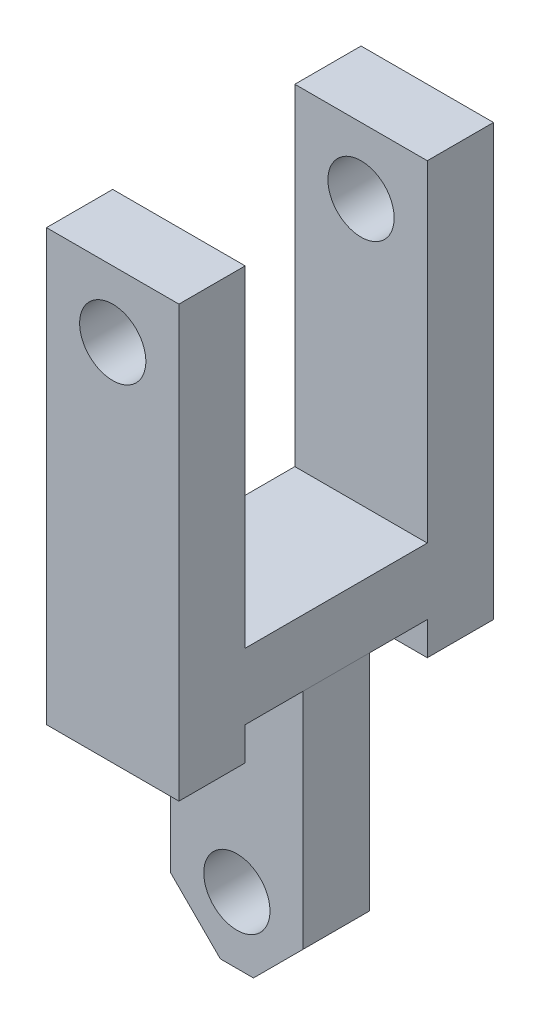
ISO-10303-21;
HEADER;
FILE_DESCRIPTION(('STEP AP214'),'2;1');
FILE_NAME('part.step','',(''),(''),'','','');
FILE_SCHEMA(('AUTOMOTIVE_DESIGN { 1 0 10303 214 1 1 1 1 }'));
ENDSEC;
DATA;
#1=APPLICATION_CONTEXT('core data for automotive mechanical design processes');
#2=APPLICATION_PROTOCOL_DEFINITION('international standard','automotive_design',2000,#1);
#3=PRODUCT_CONTEXT('',#1,'mechanical');
#4=PRODUCT('Part','Part','',(#3));
#5=PRODUCT_RELATED_PRODUCT_CATEGORY('part','',(#4));
#6=PRODUCT_DEFINITION_FORMATION('','',#4);
#7=PRODUCT_DEFINITION_CONTEXT('part definition',#1,'design');
#8=PRODUCT_DEFINITION('design','',#6,#7);
#9=PRODUCT_DEFINITION_SHAPE('','',#8);
#10=(LENGTH_UNIT() NAMED_UNIT(*) SI_UNIT(.MILLI.,.METRE.));
#11=(NAMED_UNIT(*) PLANE_ANGLE_UNIT() SI_UNIT($,.RADIAN.));
#12=(NAMED_UNIT(*) SI_UNIT($,.STERADIAN.) SOLID_ANGLE_UNIT());
#13=UNCERTAINTY_MEASURE_WITH_UNIT(LENGTH_MEASURE(1.E-05),#10,'distance_accuracy_value','');
#14=(GEOMETRIC_REPRESENTATION_CONTEXT(3) GLOBAL_UNCERTAINTY_ASSIGNED_CONTEXT((#13)) GLOBAL_UNIT_ASSIGNED_CONTEXT((#10,
#11,#12)) REPRESENTATION_CONTEXT('',''));
#15=CARTESIAN_POINT('',(0.,0.,0.));
#16=DIRECTION('',(0.,0.,1.));
#17=DIRECTION('',(1.,0.,0.));
#18=AXIS2_PLACEMENT_3D('',#15,#16,#17);
#19=CARTESIAN_POINT('',(25.401,128.5875,34.925));
#20=DIRECTION('',(0.,0.,-1.));
#21=DIRECTION('',(0.,1.,0.));
#22=AXIS2_PLACEMENT_3D('',#19,#20,#21);
#23=PLANE('',#22);
#24=DIRECTION('',(0.,1.,0.));
#25=VECTOR('',#24,1.);
#26=CARTESIAN_POINT('',(-25.4,128.5875,34.925));
#27=LINE('',#26,#25);
#28=CARTESIAN_POINT('',(-25.4,-36.5125,34.925));
#29=VERTEX_POINT('',#28);
#30=CARTESIAN_POINT('',(-25.4,-23.8125,34.925));
#31=VERTEX_POINT('',#30);
#32=EDGE_CURVE('E200',#29,#31,#27,.T.);
#33=ORIENTED_EDGE('',*,*,#32,.T.);
#34=DIRECTION('',(1.,0.,0.));
#35=VECTOR('',#34,1.);
#36=CARTESIAN_POINT('',(25.401,-23.8125,34.925));
#37=LINE('',#36,#35);
#38=CARTESIAN_POINT('',(25.4,-23.8125,34.925));
#39=VERTEX_POINT('',#38);
#40=EDGE_CURVE('E215',#31,#39,#37,.T.);
#41=ORIENTED_EDGE('',*,*,#40,.T.);
#42=DIRECTION('',(0.,1.,0.));
#43=VECTOR('',#42,1.);
#44=CARTESIAN_POINT('',(25.4,128.5875,34.925));
#45=LINE('',#44,#43);
#46=CARTESIAN_POINT('',(25.4,-36.5125,34.925));
#47=VERTEX_POINT('',#46);
#48=EDGE_CURVE('E205',#47,#39,#45,.T.);
#49=ORIENTED_EDGE('',*,*,#48,.F.);
#50=DIRECTION('',(-1.,0.,0.));
#51=VECTOR('',#50,1.);
#52=CARTESIAN_POINT('',(25.401,-36.5125,34.925));
#53=LINE('',#52,#51);
#54=EDGE_CURVE('E193',#47,#29,#53,.T.);
#55=ORIENTED_EDGE('',*,*,#54,.T.);
#56=EDGE_LOOP('',(#33,#41,#49,#55));
#57=FACE_BOUND('',#56,.T.);
#58=ADVANCED_FACE('F43',(#57),#23,.T.);
#59=CARTESIAN_POINT('',(-25.4,-128.5875,60.325));
#60=DIRECTION('',(0.,0.,1.));
#61=DIRECTION('',(1.,0.,0.));
#62=AXIS2_PLACEMENT_3D('',#59,#60,#61);
#63=PLANE('',#62);
#64=DIRECTION('',(0.,-1.,0.));
#65=VECTOR('',#64,1.);
#66=CARTESIAN_POINT('',(-25.4,128.5875,60.325));
#67=LINE('',#66,#65);
#68=CARTESIAN_POINT('',(-25.4,128.5875,60.325));
#69=VERTEX_POINT('',#68);
#70=CARTESIAN_POINT('',(-25.4,-36.5125,60.325));
#71=VERTEX_POINT('',#70);
#72=EDGE_CURVE('E180',#69,#71,#67,.T.);
#73=ORIENTED_EDGE('',*,*,#72,.T.);
#74=DIRECTION('',(-1.,0.,0.));
#75=VECTOR('',#74,1.);
#76=CARTESIAN_POINT('',(25.401,-36.5125,60.325));
#77=LINE('',#76,#75);
#78=CARTESIAN_POINT('',(25.4,-36.5125,60.325));
#79=VERTEX_POINT('',#78);
#80=EDGE_CURVE('E196',#79,#71,#77,.T.);
#81=ORIENTED_EDGE('',*,*,#80,.F.);
#82=DIRECTION('',(0.,1.,0.));
#83=VECTOR('',#82,1.);
#84=CARTESIAN_POINT('',(25.4,128.5875,60.325));
#85=LINE('',#84,#83);
#86=CARTESIAN_POINT('',(25.4,128.5875,60.325));
#87=VERTEX_POINT('',#86);
#88=EDGE_CURVE('E185',#79,#87,#85,.T.);
#89=ORIENTED_EDGE('',*,*,#88,.T.);
#90=DIRECTION('',(-1.,0.,0.));
#91=VECTOR('',#90,1.);
#92=CARTESIAN_POINT('',(-25.4,128.5875,60.325));
#93=LINE('',#92,#91);
#94=EDGE_CURVE('E182',#87,#69,#93,.T.);
#95=ORIENTED_EDGE('',*,*,#94,.T.);
#96=EDGE_LOOP('',(#73,#81,#89,#95));
#97=FACE_BOUND('',#96,.T.);
#98=CARTESIAN_POINT('',(0.,103.1875,60.325));
#99=DIRECTION('',(0.,0.,1.));
#100=DIRECTION('',(1.,0.,0.));
#101=AXIS2_PLACEMENT_3D('',#98,#99,#100);
#102=CIRCLE('',#101,12.7);
#103=CARTESIAN_POINT('',(-12.7,103.1875,60.325));
#104=VERTEX_POINT('',#103);
#105=EDGE_CURVE('E188',#104,#104,#102,.T.);
#106=ORIENTED_EDGE('',*,*,#105,.F.);
#107=EDGE_LOOP('',(#106));
#108=FACE_BOUND('',#107,.T.);
#109=ADVANCED_FACE('F267',(#97,#108),#63,.T.);
#110=CARTESIAN_POINT('',(-25.4,128.5875,60.325));
#111=DIRECTION('',(1.,0.,0.));
#112=DIRECTION('',(0.,1.,0.));
#113=AXIS2_PLACEMENT_3D('',#110,#111,#112);
#114=PLANE('',#113);
#115=DIRECTION('',(0.,0.,-1.));
#116=VECTOR('',#115,1.);
#117=CARTESIAN_POINT('',(-25.4,1.58749999999998,60.325));
#118=LINE('',#117,#116);
#119=CARTESIAN_POINT('',(-25.4,1.58749999999998,34.925));
#120=VERTEX_POINT('',#119);
#121=CARTESIAN_POINT('',(-25.4,1.58749999999998,-34.925));
#122=VERTEX_POINT('',#121);
#123=EDGE_CURVE('E143',#120,#122,#118,.T.);
#124=ORIENTED_EDGE('',*,*,#123,.T.);
#125=DIRECTION('',(0.,-1.,0.));
#126=VECTOR('',#125,1.);
#127=CARTESIAN_POINT('',(-25.4,128.5875,-34.925));
#128=LINE('',#127,#126);
#129=CARTESIAN_POINT('',(-25.4,128.5875,-34.925));
#130=VERTEX_POINT('',#129);
#131=EDGE_CURVE('E252',#130,#122,#128,.T.);
#132=ORIENTED_EDGE('',*,*,#131,.F.);
#133=DIRECTION('',(0.,0.,-1.));
#134=VECTOR('',#133,1.);
#135=CARTESIAN_POINT('',(-25.4,128.5875,60.325));
#136=LINE('',#135,#134);
#137=CARTESIAN_POINT('',(-25.4,128.5875,-60.325));
#138=VERTEX_POINT('',#137);
#139=EDGE_CURVE('E137',#130,#138,#136,.T.);
#140=ORIENTED_EDGE('',*,*,#139,.T.);
#141=DIRECTION('',(0.,-1.,0.));
#142=VECTOR('',#141,1.);
#143=CARTESIAN_POINT('',(-25.4,1.58749999999998,-60.325));
#144=LINE('',#143,#142);
#145=CARTESIAN_POINT('',(-25.4,-36.5125,-60.325));
#146=VERTEX_POINT('',#145);
#147=EDGE_CURVE('E131',#138,#146,#144,.T.);
#148=ORIENTED_EDGE('',*,*,#147,.T.);
#149=DIRECTION('',(0.,0.,-1.));
#150=VECTOR('',#149,1.);
#151=CARTESIAN_POINT('',(-25.4,-36.5125,-34.925));
#152=LINE('',#151,#150);
#153=CARTESIAN_POINT('',(-25.4,-36.5125,-34.925));
#154=VERTEX_POINT('',#153);
#155=EDGE_CURVE('E134',#154,#146,#152,.T.);
#156=ORIENTED_EDGE('',*,*,#155,.F.);
#157=CARTESIAN_POINT('',(-25.4,-23.8125,-34.925));
#158=VERTEX_POINT('',#157);
#159=EDGE_CURVE('E153',#158,#154,#128,.T.);
#160=ORIENTED_EDGE('',*,*,#159,.F.);
#161=DIRECTION('',(0.,0.,-1.));
#162=VECTOR('',#161,1.);
#163=CARTESIAN_POINT('',(-25.4,-23.8125,60.325));
#164=LINE('',#163,#162);
#165=EDGE_CURVE('E174',#31,#158,#164,.T.);
#166=ORIENTED_EDGE('',*,*,#165,.F.);
#167=ORIENTED_EDGE('',*,*,#32,.F.);
#168=DIRECTION('',(0.,0.,-1.));
#169=VECTOR('',#168,1.);
#170=CARTESIAN_POINT('',(-25.4,-36.5125,34.925));
#171=LINE('',#170,#169);
#172=EDGE_CURVE('E199',#71,#29,#171,.T.);
#173=ORIENTED_EDGE('',*,*,#172,.F.);
#174=ORIENTED_EDGE('',*,*,#72,.F.);
#175=DIRECTION('',(0.,0.,-1.));
#176=VECTOR('',#175,1.);
#177=CARTESIAN_POINT('',(-25.4,128.5875,60.325));
#178=LINE('',#177,#176);
#179=CARTESIAN_POINT('',(-25.4,128.5875,34.925));
#180=VERTEX_POINT('',#179);
#181=EDGE_CURVE('E184',#69,#180,#178,.T.);
#182=ORIENTED_EDGE('',*,*,#181,.T.);
#183=EDGE_CURVE('E195',#120,#180,#27,.T.);
#184=ORIENTED_EDGE('',*,*,#183,.F.);
#185=EDGE_LOOP('',(#124,#132,#140,#148,#156,#160,#166,#167,#173,#174,#182,#184));
#186=FACE_BOUND('',#185,.T.);
#187=ADVANCED_FACE('F45',(#186),#114,.F.);
#188=CARTESIAN_POINT('',(25.4,128.5875,60.325));
#189=DIRECTION('',(-1.,0.,0.));
#190=DIRECTION('',(0.,-1.,0.));
#191=AXIS2_PLACEMENT_3D('',#188,#189,#190);
#192=PLANE('',#191);
#193=DIRECTION('',(0.,0.,1.));
#194=VECTOR('',#193,1.);
#195=CARTESIAN_POINT('',(25.4,-23.8125,60.325));
#196=LINE('',#195,#194);
#197=CARTESIAN_POINT('',(25.4,-23.8125,-34.925));
#198=VERTEX_POINT('',#197);
#199=EDGE_CURVE('E172',#198,#39,#196,.T.);
#200=ORIENTED_EDGE('',*,*,#199,.F.);
#201=DIRECTION('',(0.,-1.,0.));
#202=VECTOR('',#201,1.);
#203=CARTESIAN_POINT('',(25.4,128.5875,-34.925));
#204=LINE('',#203,#202);
#205=CARTESIAN_POINT('',(25.4,-36.5125,-34.925));
#206=VERTEX_POINT('',#205);
#207=EDGE_CURVE('E66',#198,#206,#204,.T.);
#208=ORIENTED_EDGE('',*,*,#207,.T.);
#209=DIRECTION('',(0.,0.,-1.));
#210=VECTOR('',#209,1.);
#211=CARTESIAN_POINT('',(25.4,-36.5125,-34.925));
#212=LINE('',#211,#210);
#213=CARTESIAN_POINT('',(25.4,-36.5125,-60.325));
#214=VERTEX_POINT('',#213);
#215=EDGE_CURVE('E243',#206,#214,#212,.T.);
#216=ORIENTED_EDGE('',*,*,#215,.T.);
#217=DIRECTION('',(0.,-1.,0.));
#218=VECTOR('',#217,1.);
#219=CARTESIAN_POINT('',(25.4,1.58749999999998,-60.325));
#220=LINE('',#219,#218);
#221=CARTESIAN_POINT('',(25.4,128.5875,-60.325));
#222=VERTEX_POINT('',#221);
#223=EDGE_CURVE('E142',#222,#214,#220,.T.);
#224=ORIENTED_EDGE('',*,*,#223,.F.);
#225=DIRECTION('',(0.,0.,-1.));
#226=VECTOR('',#225,1.);
#227=CARTESIAN_POINT('',(25.4,128.5875,60.325));
#228=LINE('',#227,#226);
#229=CARTESIAN_POINT('',(25.4,128.5875,-34.925));
#230=VERTEX_POINT('',#229);
#231=EDGE_CURVE('E168',#230,#222,#228,.T.);
#232=ORIENTED_EDGE('',*,*,#231,.F.);
#233=CARTESIAN_POINT('',(25.4,1.58749999999999,-34.925));
#234=VERTEX_POINT('',#233);
#235=EDGE_CURVE('E240',#230,#234,#204,.T.);
#236=ORIENTED_EDGE('',*,*,#235,.T.);
#237=DIRECTION('',(0.,0.,1.));
#238=VECTOR('',#237,1.);
#239=CARTESIAN_POINT('',(25.4,1.58749999999998,60.325));
#240=LINE('',#239,#238);
#241=CARTESIAN_POINT('',(25.4,1.58749999999998,34.925));
#242=VERTEX_POINT('',#241);
#243=EDGE_CURVE('E177',#234,#242,#240,.T.);
#244=ORIENTED_EDGE('',*,*,#243,.T.);
#245=CARTESIAN_POINT('',(25.4,128.5875,34.925));
#246=VERTEX_POINT('',#245);
#247=EDGE_CURVE('E208',#242,#246,#45,.T.);
#248=ORIENTED_EDGE('',*,*,#247,.T.);
#249=DIRECTION('',(0.,0.,-1.));
#250=VECTOR('',#249,1.);
#251=CARTESIAN_POINT('',(25.4,128.5875,60.325));
#252=LINE('',#251,#250);
#253=EDGE_CURVE('E192',#87,#246,#252,.T.);
#254=ORIENTED_EDGE('',*,*,#253,.F.);
#255=ORIENTED_EDGE('',*,*,#88,.F.);
#256=DIRECTION('',(0.,0.,-1.));
#257=VECTOR('',#256,1.);
#258=CARTESIAN_POINT('',(25.4,-36.5125,34.925));
#259=LINE('',#258,#257);
#260=EDGE_CURVE('E204',#79,#47,#259,.T.);
#261=ORIENTED_EDGE('',*,*,#260,.T.);
#262=ORIENTED_EDGE('',*,*,#48,.T.);
#263=EDGE_LOOP('',(#200,#208,#216,#224,#232,#236,#244,#248,#254,#255,#261,#262));
#264=FACE_BOUND('',#263,.T.);
#265=ADVANCED_FACE('F235',(#264),#192,.F.);
#266=CARTESIAN_POINT('',(-25.4,128.5875,60.325));
#267=DIRECTION('',(0.,-1.,0.));
#268=DIRECTION('',(0.,0.,-1.));
#269=AXIS2_PLACEMENT_3D('',#266,#267,#268);
#270=PLANE('',#269);
#271=DIRECTION('',(-1.,0.,0.));
#272=VECTOR('',#271,1.);
#273=CARTESIAN_POINT('',(25.401,128.5875,34.925));
#274=LINE('',#273,#272);
#275=EDGE_CURVE('E201',#246,#180,#274,.T.);
#276=ORIENTED_EDGE('',*,*,#275,.T.);
#277=ORIENTED_EDGE('',*,*,#181,.F.);
#278=ORIENTED_EDGE('',*,*,#94,.F.);
#279=ORIENTED_EDGE('',*,*,#253,.T.);
#280=EDGE_LOOP('',(#276,#277,#278,#279));
#281=FACE_BOUND('',#280,.T.);
#282=ADVANCED_FACE('F282',(#281),#270,.F.);
#283=CARTESIAN_POINT('',(0.,103.1875,60.325));
#284=DIRECTION('',(0.,0.,-1.));
#285=DIRECTION('',(-1.,0.,0.));
#286=AXIS2_PLACEMENT_3D('',#283,#284,#285);
#287=CYLINDRICAL_SURFACE('',#286,12.7);
#288=CARTESIAN_POINT('',(0.,103.1875,34.925));
#289=DIRECTION('',(0.,0.,-1.));
#290=DIRECTION('',(0.,1.,0.));
#291=AXIS2_PLACEMENT_3D('',#288,#289,#290);
#292=CIRCLE('',#291,12.7);
#293=CARTESIAN_POINT('',(-12.7,103.1875,34.925));
#294=VERTEX_POINT('',#293);
#295=EDGE_CURVE('E191',#294,#294,#292,.F.);
#296=CARTESIAN_POINT('',(-12.7,103.1875,60.325));
#297=CARTESIAN_POINT('',(-12.7,103.1875,60.0604166666667));
#298=CARTESIAN_POINT('',(-12.7,103.1875,59.7958333333333));
#299=CARTESIAN_POINT('',(-12.7,103.1875,59.2666666666667));
#300=CARTESIAN_POINT('',(-12.7,103.1875,59.0020833333333));
#301=CARTESIAN_POINT('',(-12.7,103.1875,58.4729166666667));
#302=CARTESIAN_POINT('',(-12.7,103.1875,58.2083333333333));
#303=CARTESIAN_POINT('',(-12.7,103.1875,57.6791666666667));
#304=CARTESIAN_POINT('',(-12.7,103.1875,57.4145833333333));
#305=CARTESIAN_POINT('',(-12.7,103.1875,56.8854166666667));
#306=CARTESIAN_POINT('',(-12.7,103.1875,56.6208333333333));
#307=CARTESIAN_POINT('',(-12.7,103.1875,56.0916666666667));
#308=CARTESIAN_POINT('',(-12.7,103.1875,55.8270833333333));
#309=CARTESIAN_POINT('',(-12.7,103.1875,55.2979166666667));
#310=CARTESIAN_POINT('',(-12.7,103.1875,55.0333333333333));
#311=CARTESIAN_POINT('',(-12.7,103.1875,54.5041666666667));
#312=CARTESIAN_POINT('',(-12.7,103.1875,54.2395833333333));
#313=CARTESIAN_POINT('',(-12.7,103.1875,53.7104166666667));
#314=CARTESIAN_POINT('',(-12.7,103.1875,53.4458333333333));
#315=CARTESIAN_POINT('',(-12.7,103.1875,52.9166666666667));
#316=CARTESIAN_POINT('',(-12.7,103.1875,52.6520833333333));
#317=CARTESIAN_POINT('',(-12.7,103.1875,52.1229166666667));
#318=CARTESIAN_POINT('',(-12.7,103.1875,51.8583333333333));
#319=CARTESIAN_POINT('',(-12.7,103.1875,51.3291666666667));
#320=CARTESIAN_POINT('',(-12.7,103.1875,51.0645833333333));
#321=CARTESIAN_POINT('',(-12.7,103.1875,50.5354166666667));
#322=CARTESIAN_POINT('',(-12.7,103.1875,50.2708333333333));
#323=CARTESIAN_POINT('',(-12.7,103.1875,49.7416666666667));
#324=CARTESIAN_POINT('',(-12.7,103.1875,49.4770833333333));
#325=CARTESIAN_POINT('',(-12.7,103.1875,48.9479166666667));
#326=CARTESIAN_POINT('',(-12.7,103.1875,48.6833333333333));
#327=CARTESIAN_POINT('',(-12.7,103.1875,48.1541666666667));
#328=CARTESIAN_POINT('',(-12.7,103.1875,47.8895833333333));
#329=CARTESIAN_POINT('',(-12.7,103.1875,47.3604166666667));
#330=CARTESIAN_POINT('',(-12.7,103.1875,47.0958333333333));
#331=CARTESIAN_POINT('',(-12.7,103.1875,46.5666666666667));
#332=CARTESIAN_POINT('',(-12.7,103.1875,46.3020833333333));
#333=CARTESIAN_POINT('',(-12.7,103.1875,45.7729166666667));
#334=CARTESIAN_POINT('',(-12.7,103.1875,45.5083333333333));
#335=CARTESIAN_POINT('',(-12.7,103.1875,44.9791666666667));
#336=CARTESIAN_POINT('',(-12.7,103.1875,44.7145833333333));
#337=CARTESIAN_POINT('',(-12.7,103.1875,44.1854166666667));
#338=CARTESIAN_POINT('',(-12.7,103.1875,43.9208333333333));
#339=CARTESIAN_POINT('',(-12.7,103.1875,43.3916666666667));
#340=CARTESIAN_POINT('',(-12.7,103.1875,43.1270833333333));
#341=CARTESIAN_POINT('',(-12.7,103.1875,42.5979166666667));
#342=CARTESIAN_POINT('',(-12.7,103.1875,42.3333333333333));
#343=CARTESIAN_POINT('',(-12.7,103.1875,41.8041666666667));
#344=CARTESIAN_POINT('',(-12.7,103.1875,41.5395833333333));
#345=CARTESIAN_POINT('',(-12.7,103.1875,41.0104166666667));
#346=CARTESIAN_POINT('',(-12.7,103.1875,40.7458333333333));
#347=CARTESIAN_POINT('',(-12.7,103.1875,40.2166666666667));
#348=CARTESIAN_POINT('',(-12.7,103.1875,39.9520833333333));
#349=CARTESIAN_POINT('',(-12.7,103.1875,39.4229166666667));
#350=CARTESIAN_POINT('',(-12.7,103.1875,39.1583333333333));
#351=CARTESIAN_POINT('',(-12.7,103.1875,38.6291666666667));
#352=CARTESIAN_POINT('',(-12.7,103.1875,38.3645833333333));
#353=CARTESIAN_POINT('',(-12.7,103.1875,37.8354166666667));
#354=CARTESIAN_POINT('',(-12.7,103.1875,37.5708333333333));
#355=CARTESIAN_POINT('',(-12.7,103.1875,37.0416666666667));
#356=CARTESIAN_POINT('',(-12.7,103.1875,36.7770833333333));
#357=CARTESIAN_POINT('',(-12.7,103.1875,36.2479166666667));
#358=CARTESIAN_POINT('',(-12.7,103.1875,35.9833333333333));
#359=CARTESIAN_POINT('',(-12.7,103.1875,35.4541666666667));
#360=CARTESIAN_POINT('',(-12.7,103.1875,35.1895833333333));
#361=CARTESIAN_POINT('',(-12.7,103.1875,34.925));
#362=B_SPLINE_CURVE_WITH_KNOTS('',3,(#296,#297,#298,#299,#300,#301,#302,#303,#304,#305,#306,
#307,#308,#309,#310,#311,#312,#313,#314,#315,#316,#317,#318,#319,#320,#321,#322,#323,#324,#325,
#326,#327,#328,#329,#330,#331,#332,#333,#334,#335,#336,#337,#338,#339,#340,#341,#342,#343,#344,
#345,#346,#347,#348,#349,#350,#351,#352,#353,#354,#355,#356,#357,#358,#359,#360,#361),
.UNSPECIFIED.,.F.,.F.,(4,2,2,2,2,2,2,2,2,2,2,2,2,2,2,2,2,2,2,2,2,2,2,2,2,2,2,2,2,2,2,2,4),(0.,
0.793750000000003,1.58750000000001,2.38125,3.175,3.96875,4.7625,5.55625,6.35,7.14375,7.9375,
8.73125,9.525,10.31875,11.1125,11.90625,12.7,13.49375,14.2875,15.08125,15.875,16.66875,17.4625,
18.25625,19.05,19.84375,20.6375,21.43125,22.225,23.01875,23.8125,24.60625,25.4),.UNSPECIFIED.);
#363=EDGE_CURVE('BSEAM277',#104,#294,#362,.T.);
#364=ORIENTED_EDGE('',*,*,#105,.T.);
#365=ORIENTED_EDGE('',*,*,#295,.F.);
#366=ORIENTED_EDGE('',*,*,#363,.T.);
#367=ORIENTED_EDGE('',*,*,#363,.F.);
#368=EDGE_LOOP('',(#364,#366,#365,#367));
#369=FACE_BOUND('',#368,.T.);
#370=ADVANCED_FACE('F277',(#369),#287,.F.);
#371=DIRECTION('',(1.,0.,0.));
#372=VECTOR('',#371,1.);
#373=CARTESIAN_POINT('',(25.401,1.58749999999999,34.925));
#374=LINE('',#373,#372);
#375=EDGE_CURVE('E51',#120,#242,#374,.T.);
#376=ORIENTED_EDGE('',*,*,#375,.F.);
#377=ORIENTED_EDGE('',*,*,#183,.T.);
#378=ORIENTED_EDGE('',*,*,#275,.F.);
#379=ORIENTED_EDGE('',*,*,#247,.F.);
#380=EDGE_LOOP('',(#376,#377,#378,#379));
#381=FACE_BOUND('',#380,.T.);
#382=ORIENTED_EDGE('',*,*,#295,.T.);
#383=EDGE_LOOP('',(#382));
#384=FACE_BOUND('',#383,.T.);
#385=ADVANCED_FACE('F230',(#381,#384),#23,.T.);
#386=CARTESIAN_POINT('',(25.401,-36.5125,34.925));
#387=DIRECTION('',(0.,-1.,0.));
#388=DIRECTION('',(0.,0.,-1.));
#389=AXIS2_PLACEMENT_3D('',#386,#387,#388);
#390=PLANE('',#389);
#391=ORIENTED_EDGE('',*,*,#80,.T.);
#392=ORIENTED_EDGE('',*,*,#172,.T.);
#393=ORIENTED_EDGE('',*,*,#54,.F.);
#394=ORIENTED_EDGE('',*,*,#260,.F.);
#395=EDGE_LOOP('',(#391,#392,#393,#394));
#396=FACE_BOUND('',#395,.T.);
#397=ADVANCED_FACE('F276',(#396),#390,.T.);
#398=CARTESIAN_POINT('',(25.4,1.58749999999998,-60.325));
#399=DIRECTION('',(0.,0.,-1.));
#400=DIRECTION('',(-1.,0.,0.));
#401=AXIS2_PLACEMENT_3D('',#398,#399,#400);
#402=PLANE('',#401);
#403=ORIENTED_EDGE('',*,*,#223,.T.);
#404=DIRECTION('',(-1.,0.,0.));
#405=VECTOR('',#404,1.);
#406=CARTESIAN_POINT('',(25.401,-36.5125,-60.325));
#407=LINE('',#406,#405);
#408=EDGE_CURVE('E150',#214,#146,#407,.T.);
#409=ORIENTED_EDGE('',*,*,#408,.T.);
#410=ORIENTED_EDGE('',*,*,#147,.F.);
#411=DIRECTION('',(-1.,0.,0.));
#412=VECTOR('',#411,1.);
#413=CARTESIAN_POINT('',(-25.4,128.5875,-60.325));
#414=LINE('',#413,#412);
#415=EDGE_CURVE('E160',#222,#138,#414,.T.);
#416=ORIENTED_EDGE('',*,*,#415,.F.);
#417=EDGE_LOOP('',(#403,#409,#410,#416));
#418=FACE_BOUND('',#417,.T.);
#419=CARTESIAN_POINT('',(0.,103.1875,-60.325));
#420=DIRECTION('',(0.,0.,1.));
#421=DIRECTION('',(1.,0.,0.));
#422=AXIS2_PLACEMENT_3D('',#419,#420,#421);
#423=CIRCLE('',#422,12.7);
#424=CARTESIAN_POINT('',(-12.7,103.1875,-60.325));
#425=VERTEX_POINT('',#424);
#426=EDGE_CURVE('E157',#425,#425,#423,.T.);
#427=ORIENTED_EDGE('',*,*,#426,.T.);
#428=EDGE_LOOP('',(#427));
#429=FACE_BOUND('',#428,.T.);
#430=ADVANCED_FACE('F155',(#418,#429),#402,.T.);
#431=CARTESIAN_POINT('',(25.4,1.58749999999998,-60.325));
#432=DIRECTION('',(0.,1.,0.));
#433=DIRECTION('',(0.,0.,1.));
#434=AXIS2_PLACEMENT_3D('',#431,#432,#433);
#435=PLANE('',#434);
#436=DIRECTION('',(1.,0.,0.));
#437=VECTOR('',#436,1.);
#438=CARTESIAN_POINT('',(25.4,1.58749999999998,-34.925));
#439=LINE('',#438,#437);
#440=EDGE_CURVE('E58',#122,#234,#439,.T.);
#441=ORIENTED_EDGE('',*,*,#440,.F.);
#442=ORIENTED_EDGE('',*,*,#123,.F.);
#443=ORIENTED_EDGE('',*,*,#375,.T.);
#444=ORIENTED_EDGE('',*,*,#243,.F.);
#445=EDGE_LOOP('',(#441,#442,#443,#444));
#446=FACE_BOUND('',#445,.T.);
#447=ADVANCED_FACE('F226',(#446),#435,.T.);
#448=CARTESIAN_POINT('',(25.4,-23.8125,-60.325));
#449=DIRECTION('',(0.,1.,0.));
#450=DIRECTION('',(0.,0.,1.));
#451=AXIS2_PLACEMENT_3D('',#448,#449,#450);
#452=PLANE('',#451);
#453=ORIENTED_EDGE('',*,*,#165,.T.);
#454=DIRECTION('',(1.,0.,0.));
#455=VECTOR('',#454,1.);
#456=CARTESIAN_POINT('',(25.4,-23.8125,-34.925));
#457=LINE('',#456,#455);
#458=EDGE_CURVE('E12',#158,#198,#457,.T.);
#459=ORIENTED_EDGE('',*,*,#458,.T.);
#460=ORIENTED_EDGE('',*,*,#199,.T.);
#461=ORIENTED_EDGE('',*,*,#40,.F.);
#462=EDGE_LOOP('',(#453,#459,#460,#461));
#463=FACE_BOUND('',#462,.T.);
#464=ADVANCED_FACE('F348',(#463),#452,.F.);
#465=CARTESIAN_POINT('',(25.401,-36.5125,-34.925));
#466=DIRECTION('',(0.,-1.,0.));
#467=DIRECTION('',(0.,0.,-1.));
#468=AXIS2_PLACEMENT_3D('',#465,#466,#467);
#469=PLANE('',#468);
#470=DIRECTION('',(-1.,0.,0.));
#471=VECTOR('',#470,1.);
#472=CARTESIAN_POINT('',(25.401,-36.5125,-34.925));
#473=LINE('',#472,#471);
#474=EDGE_CURVE('E152',#206,#154,#473,.T.);
#475=ORIENTED_EDGE('',*,*,#474,.T.);
#476=ORIENTED_EDGE('',*,*,#155,.T.);
#477=ORIENTED_EDGE('',*,*,#408,.F.);
#478=ORIENTED_EDGE('',*,*,#215,.F.);
#479=EDGE_LOOP('',(#475,#476,#477,#478));
#480=FACE_BOUND('',#479,.T.);
#481=ADVANCED_FACE('F148',(#480),#469,.T.);
#482=CARTESIAN_POINT('',(25.401,128.5875,-34.925));
#483=DIRECTION('',(0.,0.,1.));
#484=DIRECTION('',(0.,-1.,0.));
#485=AXIS2_PLACEMENT_3D('',#482,#483,#484);
#486=PLANE('',#485);
#487=ORIENTED_EDGE('',*,*,#458,.F.);
#488=ORIENTED_EDGE('',*,*,#159,.T.);
#489=ORIENTED_EDGE('',*,*,#474,.F.);
#490=ORIENTED_EDGE('',*,*,#207,.F.);
#491=EDGE_LOOP('',(#487,#488,#489,#490));
#492=FACE_BOUND('',#491,.T.);
#493=ADVANCED_FACE('F257',(#492),#486,.T.);
#494=CARTESIAN_POINT('',(-25.4,128.5875,60.325));
#495=DIRECTION('',(0.,-1.,0.));
#496=DIRECTION('',(0.,0.,-1.));
#497=AXIS2_PLACEMENT_3D('',#494,#495,#496);
#498=PLANE('',#497);
#499=DIRECTION('',(-1.,0.,0.));
#500=VECTOR('',#499,1.);
#501=CARTESIAN_POINT('',(25.401,128.5875,-34.925));
#502=LINE('',#501,#500);
#503=EDGE_CURVE('E162',#230,#130,#502,.T.);
#504=ORIENTED_EDGE('',*,*,#503,.F.);
#505=ORIENTED_EDGE('',*,*,#231,.T.);
#506=ORIENTED_EDGE('',*,*,#415,.T.);
#507=ORIENTED_EDGE('',*,*,#139,.F.);
#508=EDGE_LOOP('',(#504,#505,#506,#507));
#509=FACE_BOUND('',#508,.T.);
#510=ADVANCED_FACE('F254',(#509),#498,.F.);
#511=CARTESIAN_POINT('',(0.,103.1875,60.325));
#512=DIRECTION('',(0.,0.,-1.));
#513=DIRECTION('',(-1.,0.,0.));
#514=AXIS2_PLACEMENT_3D('',#511,#512,#513);
#515=CYLINDRICAL_SURFACE('',#514,12.7);
#516=CARTESIAN_POINT('',(0.,103.1875,-34.925));
#517=DIRECTION('',(0.,0.,1.));
#518=DIRECTION('',(0.,-1.,0.));
#519=AXIS2_PLACEMENT_3D('',#516,#517,#518);
#520=CIRCLE('',#519,12.7);
#521=CARTESIAN_POINT('',(-12.7,103.1875,-34.925));
#522=VERTEX_POINT('',#521);
#523=EDGE_CURVE('E246',#522,#522,#520,.F.);
#524=CARTESIAN_POINT('',(-12.7,103.1875,-60.325));
#525=CARTESIAN_POINT('',(-12.7,103.1875,-60.0604166666667));
#526=CARTESIAN_POINT('',(-12.7,103.1875,-59.7958333333333));
#527=CARTESIAN_POINT('',(-12.7,103.1875,-59.2666666666667));
#528=CARTESIAN_POINT('',(-12.7,103.1875,-59.0020833333333));
#529=CARTESIAN_POINT('',(-12.7,103.1875,-58.4729166666667));
#530=CARTESIAN_POINT('',(-12.7,103.1875,-58.2083333333333));
#531=CARTESIAN_POINT('',(-12.7,103.1875,-57.6791666666667));
#532=CARTESIAN_POINT('',(-12.7,103.1875,-57.4145833333333));
#533=CARTESIAN_POINT('',(-12.7,103.1875,-56.8854166666667));
#534=CARTESIAN_POINT('',(-12.7,103.1875,-56.6208333333333));
#535=CARTESIAN_POINT('',(-12.7,103.1875,-56.0916666666667));
#536=CARTESIAN_POINT('',(-12.7,103.1875,-55.8270833333333));
#537=CARTESIAN_POINT('',(-12.7,103.1875,-55.2979166666667));
#538=CARTESIAN_POINT('',(-12.7,103.1875,-55.0333333333333));
#539=CARTESIAN_POINT('',(-12.7,103.1875,-54.5041666666667));
#540=CARTESIAN_POINT('',(-12.7,103.1875,-54.2395833333333));
#541=CARTESIAN_POINT('',(-12.7,103.1875,-53.7104166666667));
#542=CARTESIAN_POINT('',(-12.7,103.1875,-53.4458333333333));
#543=CARTESIAN_POINT('',(-12.7,103.1875,-52.9166666666667));
#544=CARTESIAN_POINT('',(-12.7,103.1875,-52.6520833333333));
#545=CARTESIAN_POINT('',(-12.7,103.1875,-52.1229166666667));
#546=CARTESIAN_POINT('',(-12.7,103.1875,-51.8583333333333));
#547=CARTESIAN_POINT('',(-12.7,103.1875,-51.3291666666667));
#548=CARTESIAN_POINT('',(-12.7,103.1875,-51.0645833333333));
#549=CARTESIAN_POINT('',(-12.7,103.1875,-50.5354166666667));
#550=CARTESIAN_POINT('',(-12.7,103.1875,-50.2708333333333));
#551=CARTESIAN_POINT('',(-12.7,103.1875,-49.7416666666667));
#552=CARTESIAN_POINT('',(-12.7,103.1875,-49.4770833333333));
#553=CARTESIAN_POINT('',(-12.7,103.1875,-48.9479166666667));
#554=CARTESIAN_POINT('',(-12.7,103.1875,-48.6833333333333));
#555=CARTESIAN_POINT('',(-12.7,103.1875,-48.1541666666667));
#556=CARTESIAN_POINT('',(-12.7,103.1875,-47.8895833333333));
#557=CARTESIAN_POINT('',(-12.7,103.1875,-47.3604166666667));
#558=CARTESIAN_POINT('',(-12.7,103.1875,-47.0958333333333));
#559=CARTESIAN_POINT('',(-12.7,103.1875,-46.5666666666667));
#560=CARTESIAN_POINT('',(-12.7,103.1875,-46.3020833333333));
#561=CARTESIAN_POINT('',(-12.7,103.1875,-45.7729166666667));
#562=CARTESIAN_POINT('',(-12.7,103.1875,-45.5083333333333));
#563=CARTESIAN_POINT('',(-12.7,103.1875,-44.9791666666667));
#564=CARTESIAN_POINT('',(-12.7,103.1875,-44.7145833333333));
#565=CARTESIAN_POINT('',(-12.7,103.1875,-44.1854166666667));
#566=CARTESIAN_POINT('',(-12.7,103.1875,-43.9208333333333));
#567=CARTESIAN_POINT('',(-12.7,103.1875,-43.3916666666667));
#568=CARTESIAN_POINT('',(-12.7,103.1875,-43.1270833333333));
#569=CARTESIAN_POINT('',(-12.7,103.1875,-42.5979166666667));
#570=CARTESIAN_POINT('',(-12.7,103.1875,-42.3333333333333));
#571=CARTESIAN_POINT('',(-12.7,103.1875,-41.8041666666667));
#572=CARTESIAN_POINT('',(-12.7,103.1875,-41.5395833333333));
#573=CARTESIAN_POINT('',(-12.7,103.1875,-41.0104166666667));
#574=CARTESIAN_POINT('',(-12.7,103.1875,-40.7458333333334));
#575=CARTESIAN_POINT('',(-12.7,103.1875,-40.2166666666667));
#576=CARTESIAN_POINT('',(-12.7,103.1875,-39.9520833333334));
#577=CARTESIAN_POINT('',(-12.7,103.1875,-39.4229166666667));
#578=CARTESIAN_POINT('',(-12.7,103.1875,-39.1583333333334));
#579=CARTESIAN_POINT('',(-12.7,103.1875,-38.6291666666667));
#580=CARTESIAN_POINT('',(-12.7,103.1875,-38.3645833333333));
#581=CARTESIAN_POINT('',(-12.7,103.1875,-37.8354166666667));
#582=CARTESIAN_POINT('',(-12.7,103.1875,-37.5708333333334));
#583=CARTESIAN_POINT('',(-12.7,103.1875,-37.0416666666667));
#584=CARTESIAN_POINT('',(-12.7,103.1875,-36.7770833333334));
#585=CARTESIAN_POINT('',(-12.7,103.1875,-36.2479166666667));
#586=CARTESIAN_POINT('',(-12.7,103.1875,-35.9833333333333));
#587=CARTESIAN_POINT('',(-12.7,103.1875,-35.4541666666667));
#588=CARTESIAN_POINT('',(-12.7,103.1875,-35.1895833333334));
#589=CARTESIAN_POINT('',(-12.7,103.1875,-34.925));
#590=B_SPLINE_CURVE_WITH_KNOTS('',3,(#524,#525,#526,#527,#528,#529,#530,#531,#532,#533,#534,
#535,#536,#537,#538,#539,#540,#541,#542,#543,#544,#545,#546,#547,#548,#549,#550,#551,#552,#553,
#554,#555,#556,#557,#558,#559,#560,#561,#562,#563,#564,#565,#566,#567,#568,#569,#570,#571,#572,
#573,#574,#575,#576,#577,#578,#579,#580,#581,#582,#583,#584,#585,#586,#587,#588,#589),
.UNSPECIFIED.,.F.,.F.,(4,2,2,2,2,2,2,2,2,2,2,2,2,2,2,2,2,2,2,2,2,2,2,2,2,2,2,2,2,2,2,2,4),(0.,
0.793749999999996,1.58749999999999,2.38125,3.175,3.96874999999999,4.7625,5.55625,
6.34999999999999,7.14374999999999,7.93749999999999,8.73125,9.52499999999999,10.31875,11.1125,
11.90625,12.7,13.49375,14.2875,15.08125,15.875,16.66875,17.4625,18.25625,19.05,19.84375,20.6375,
21.43125,22.225,23.01875,23.8125,24.60625,25.4),.UNSPECIFIED.);
#591=EDGE_CURVE('BSEAM256',#425,#522,#590,.T.);
#592=ORIENTED_EDGE('',*,*,#426,.F.);
#593=ORIENTED_EDGE('',*,*,#523,.F.);
#594=ORIENTED_EDGE('',*,*,#591,.T.);
#595=ORIENTED_EDGE('',*,*,#591,.F.);
#596=EDGE_LOOP('',(#592,#594,#593,#595));
#597=FACE_BOUND('',#596,.T.);
#598=ADVANCED_FACE('F256',(#597),#515,.F.);
#599=ORIENTED_EDGE('',*,*,#131,.T.);
#600=ORIENTED_EDGE('',*,*,#440,.T.);
#601=ORIENTED_EDGE('',*,*,#235,.F.);
#602=ORIENTED_EDGE('',*,*,#503,.T.);
#603=EDGE_LOOP('',(#599,#600,#601,#602));
#604=FACE_BOUND('',#603,.T.);
#605=ORIENTED_EDGE('',*,*,#523,.T.);
#606=EDGE_LOOP('',(#605));
#607=FACE_BOUND('',#606,.T.);
#608=ADVANCED_FACE('F250',(#604,#607),#486,.T.);
#609=CLOSED_SHELL('',(#58,#109,#187,#265,#282,#370,#385,#397,#430,#447,#464,#481,#493,#510,#598,#608));
#610=MANIFOLD_SOLID_BREP('B2',#609);
#611=CARTESIAN_POINT('',(6.35,-128.5875,-60.325));
#612=DIRECTION('',(-0.707106781186548,0.707106781186548,0.));
#613=DIRECTION('',(-0.707106781186548,-0.707106781186548,0.));
#614=AXIS2_PLACEMENT_3D('',#611,#612,#613);
#615=PLANE('',#614);
#616=DIRECTION('',(-0.707106781186548,-0.707106781186548,0.));
#617=VECTOR('',#616,1.);
#618=CARTESIAN_POINT('',(68.263,-66.6745,12.7));
#619=LINE('',#618,#617);
#620=CARTESIAN_POINT('',(25.4,-109.5375,12.7));
#621=VERTEX_POINT('',#620);
#622=CARTESIAN_POINT('',(6.35,-128.5875,12.7));
#623=VERTEX_POINT('',#622);
#624=EDGE_CURVE('E457',#621,#623,#619,.T.);
#625=ORIENTED_EDGE('',*,*,#624,.T.);
#626=DIRECTION('',(0.,0.,1.));
#627=VECTOR('',#626,1.);
#628=CARTESIAN_POINT('',(6.35,-128.5875,-60.325));
#629=LINE('',#628,#627);
#630=CARTESIAN_POINT('',(6.35,-128.5875,-12.7));
#631=VERTEX_POINT('',#630);
#632=EDGE_CURVE('E504',#631,#623,#629,.T.);
#633=ORIENTED_EDGE('',*,*,#632,.F.);
#634=DIRECTION('',(0.707106781186548,0.707106781186548,0.));
#635=VECTOR('',#634,1.);
#636=CARTESIAN_POINT('',(15.8755,-119.062,-12.7));
#637=LINE('',#636,#635);
#638=CARTESIAN_POINT('',(25.4,-109.5375,-12.7));
#639=VERTEX_POINT('',#638);
#640=EDGE_CURVE('E498',#631,#639,#637,.T.);
#641=ORIENTED_EDGE('',*,*,#640,.T.);
#642=DIRECTION('',(0.,0.,1.));
#643=VECTOR('',#642,1.);
#644=CARTESIAN_POINT('',(25.4,-109.5375,-60.325));
#645=LINE('',#644,#643);
#646=EDGE_CURVE('E462',#639,#621,#645,.T.);
#647=ORIENTED_EDGE('',*,*,#646,.T.);
#648=EDGE_LOOP('',(#625,#633,#641,#647));
#649=FACE_BOUND('',#648,.T.);
#650=ADVANCED_FACE('F403',(#649),#615,.F.);
#651=CARTESIAN_POINT('',(25.4,128.5875,60.325));
#652=DIRECTION('',(-1.,0.,0.));
#653=DIRECTION('',(0.,-1.,0.));
#654=AXIS2_PLACEMENT_3D('',#651,#652,#653);
#655=PLANE('',#654);
#656=DIRECTION('',(0.,-1.,0.));
#657=VECTOR('',#656,1.);
#658=CARTESIAN_POINT('',(25.4,-23.8125,12.7));
#659=LINE('',#658,#657);
#660=CARTESIAN_POINT('',(25.4,-23.8125,12.7));
#661=VERTEX_POINT('',#660);
#662=EDGE_CURVE('E453',#661,#621,#659,.T.);
#663=ORIENTED_EDGE('',*,*,#662,.T.);
#664=ORIENTED_EDGE('',*,*,#646,.F.);
#665=DIRECTION('',(0.,1.,0.));
#666=VECTOR('',#665,1.);
#667=CARTESIAN_POINT('',(25.4,-128.5875,-12.7));
#668=LINE('',#667,#666);
#669=CARTESIAN_POINT('',(25.4,-23.8125,-12.7));
#670=VERTEX_POINT('',#669);
#671=EDGE_CURVE('E461',#639,#670,#668,.T.);
#672=ORIENTED_EDGE('',*,*,#671,.T.);
#673=DIRECTION('',(0.,0.,1.));
#674=VECTOR('',#673,1.);
#675=CARTESIAN_POINT('',(25.4,-23.8125,-12.7));
#676=LINE('',#675,#674);
#677=EDGE_CURVE('E421',#670,#661,#676,.T.);
#678=ORIENTED_EDGE('',*,*,#677,.T.);
#679=EDGE_LOOP('',(#663,#664,#672,#678));
#680=FACE_BOUND('',#679,.T.);
#681=ADVANCED_FACE('F471',(#680),#655,.F.);
#682=CARTESIAN_POINT('',(-25.4,-109.5375,-60.325));
#683=DIRECTION('',(0.707106781186548,0.707106781186548,0.));
#684=DIRECTION('',(-0.707106781186548,0.707106781186548,0.));
#685=AXIS2_PLACEMENT_3D('',#682,#683,#684);
#686=PLANE('',#685);
#687=DIRECTION('',(0.707106781186548,-0.707106781186548,0.));
#688=VECTOR('',#687,1.);
#689=CARTESIAN_POINT('',(-68.263,-66.6745,12.7));
#690=LINE('',#689,#688);
#691=CARTESIAN_POINT('',(-25.4,-109.5375,12.7));
#692=VERTEX_POINT('',#691);
#693=CARTESIAN_POINT('',(-6.35,-128.5875,12.7));
#694=VERTEX_POINT('',#693);
#695=EDGE_CURVE('E468',#692,#694,#690,.T.);
#696=ORIENTED_EDGE('',*,*,#695,.F.);
#697=DIRECTION('',(0.,0.,1.));
#698=VECTOR('',#697,1.);
#699=CARTESIAN_POINT('',(-25.4,-109.5375,-60.325));
#700=LINE('',#699,#698);
#701=CARTESIAN_POINT('',(-25.4,-109.5375,-12.7));
#702=VERTEX_POINT('',#701);
#703=EDGE_CURVE('E510',#702,#692,#700,.T.);
#704=ORIENTED_EDGE('',*,*,#703,.F.);
#705=DIRECTION('',(-0.707106781186548,0.707106781186548,0.));
#706=VECTOR('',#705,1.);
#707=CARTESIAN_POINT('',(-15.8755,-119.062,-12.7));
#708=LINE('',#707,#706);
#709=CARTESIAN_POINT('',(-6.35000000000001,-128.5875,-12.7));
#710=VERTEX_POINT('',#709);
#711=EDGE_CURVE('E486',#710,#702,#708,.T.);
#712=ORIENTED_EDGE('',*,*,#711,.F.);
#713=DIRECTION('',(0.,0.,1.));
#714=VECTOR('',#713,1.);
#715=CARTESIAN_POINT('',(-6.35,-128.5875,-60.325));
#716=LINE('',#715,#714);
#717=EDGE_CURVE('E472',#710,#694,#716,.T.);
#718=ORIENTED_EDGE('',*,*,#717,.T.);
#719=EDGE_LOOP('',(#696,#704,#712,#718));
#720=FACE_BOUND('',#719,.T.);
#721=ADVANCED_FACE('F517',(#720),#686,.F.);
#722=CARTESIAN_POINT('',(-25.4,-128.5875,60.325));
#723=DIRECTION('',(0.,1.,0.));
#724=DIRECTION('',(0.,0.,1.));
#725=AXIS2_PLACEMENT_3D('',#722,#723,#724);
#726=PLANE('',#725);
#727=DIRECTION('',(-1.,0.,0.));
#728=VECTOR('',#727,1.);
#729=CARTESIAN_POINT('',(25.401,-128.5875,12.7));
#730=LINE('',#729,#728);
#731=EDGE_CURVE('E475',#623,#694,#730,.T.);
#732=ORIENTED_EDGE('',*,*,#731,.T.);
#733=ORIENTED_EDGE('',*,*,#717,.F.);
#734=DIRECTION('',(-1.,0.,0.));
#735=VECTOR('',#734,1.);
#736=CARTESIAN_POINT('',(25.401,-128.5875,-12.7));
#737=LINE('',#736,#735);
#738=EDGE_CURVE('E485',#631,#710,#737,.T.);
#739=ORIENTED_EDGE('',*,*,#738,.F.);
#740=ORIENTED_EDGE('',*,*,#632,.T.);
#741=EDGE_LOOP('',(#732,#733,#739,#740));
#742=FACE_BOUND('',#741,.T.);
#743=ADVANCED_FACE('F519',(#742),#726,.F.);
#744=CARTESIAN_POINT('',(-25.4,128.5875,60.325));
#745=DIRECTION('',(1.,0.,0.));
#746=DIRECTION('',(0.,1.,0.));
#747=AXIS2_PLACEMENT_3D('',#744,#745,#746);
#748=PLANE('',#747);
#749=DIRECTION('',(0.,-1.,0.));
#750=VECTOR('',#749,1.);
#751=CARTESIAN_POINT('',(-25.4,-23.8125,12.7));
#752=LINE('',#751,#750);
#753=CARTESIAN_POINT('',(-25.4,-23.8125,12.7));
#754=VERTEX_POINT('',#753);
#755=EDGE_CURVE('E407',#754,#692,#752,.T.);
#756=ORIENTED_EDGE('',*,*,#755,.F.);
#757=DIRECTION('',(0.,0.,1.));
#758=VECTOR('',#757,1.);
#759=CARTESIAN_POINT('',(-25.4,-23.8125,-12.7));
#760=LINE('',#759,#758);
#761=CARTESIAN_POINT('',(-25.4,-23.8125,-12.7));
#762=VERTEX_POINT('',#761);
#763=EDGE_CURVE('E41',#762,#754,#760,.T.);
#764=ORIENTED_EDGE('',*,*,#763,.F.);
#765=DIRECTION('',(0.,1.,0.));
#766=VECTOR('',#765,1.);
#767=CARTESIAN_POINT('',(-25.4,-128.5875,-12.7));
#768=LINE('',#767,#766);
#769=EDGE_CURVE('E488',#702,#762,#768,.T.);
#770=ORIENTED_EDGE('',*,*,#769,.F.);
#771=ORIENTED_EDGE('',*,*,#703,.T.);
#772=EDGE_LOOP('',(#756,#764,#770,#771));
#773=FACE_BOUND('',#772,.T.);
#774=ADVANCED_FACE('F405',(#773),#748,.F.);
#775=CARTESIAN_POINT('',(25.401,-23.8125,12.7));
#776=DIRECTION('',(0.,0.,1.));
#777=DIRECTION('',(1.,0.,0.));
#778=AXIS2_PLACEMENT_3D('',#775,#776,#777);
#779=PLANE('',#778);
#780=ORIENTED_EDGE('',*,*,#755,.T.);
#781=ORIENTED_EDGE('',*,*,#695,.T.);
#782=ORIENTED_EDGE('',*,*,#731,.F.);
#783=ORIENTED_EDGE('',*,*,#624,.F.);
#784=ORIENTED_EDGE('',*,*,#662,.F.);
#785=DIRECTION('',(-1.,0.,0.));
#786=VECTOR('',#785,1.);
#787=CARTESIAN_POINT('',(25.401,-23.8125,12.7));
#788=LINE('',#787,#786);
#789=EDGE_CURVE('E450',#661,#754,#788,.T.);
#790=ORIENTED_EDGE('',*,*,#789,.T.);
#791=EDGE_LOOP('',(#780,#781,#782,#783,#784,#790));
#792=FACE_BOUND('',#791,.T.);
#793=CARTESIAN_POINT('',(0.,-103.1875,12.7));
#794=DIRECTION('',(0.,0.,1.));
#795=DIRECTION('',(1.,0.,0.));
#796=AXIS2_PLACEMENT_3D('',#793,#794,#795);
#797=CIRCLE('',#796,12.7);
#798=CARTESIAN_POINT('',(-12.7,-103.1875,12.7));
#799=VERTEX_POINT('',#798);
#800=EDGE_CURVE('E467',#799,#799,#797,.F.);
#801=ORIENTED_EDGE('',*,*,#800,.T.);
#802=EDGE_LOOP('',(#801));
#803=FACE_BOUND('',#802,.T.);
#804=ADVANCED_FACE('F454',(#792,#803),#779,.T.);
#805=CARTESIAN_POINT('',(25.401,-128.5875,-12.7));
#806=DIRECTION('',(0.,0.,-1.));
#807=DIRECTION('',(-1.,0.,0.));
#808=AXIS2_PLACEMENT_3D('',#805,#806,#807);
#809=PLANE('',#808);
#810=CARTESIAN_POINT('',(0.,-103.1875,-12.7));
#811=DIRECTION('',(0.,0.,-1.));
#812=DIRECTION('',(-1.,0.,0.));
#813=AXIS2_PLACEMENT_3D('',#810,#811,#812);
#814=CIRCLE('',#813,12.7);
#815=CARTESIAN_POINT('',(-12.7,-103.1875,-12.7));
#816=VERTEX_POINT('',#815);
#817=EDGE_CURVE('E482',#816,#816,#814,.F.);
#818=ORIENTED_EDGE('',*,*,#817,.T.);
#819=EDGE_LOOP('',(#818));
#820=FACE_BOUND('',#819,.T.);
#821=DIRECTION('',(-1.,0.,0.));
#822=VECTOR('',#821,1.);
#823=CARTESIAN_POINT('',(25.401,-23.8125,-12.7));
#824=LINE('',#823,#822);
#825=EDGE_CURVE('E413',#670,#762,#824,.T.);
#826=ORIENTED_EDGE('',*,*,#825,.F.);
#827=ORIENTED_EDGE('',*,*,#671,.F.);
#828=ORIENTED_EDGE('',*,*,#640,.F.);
#829=ORIENTED_EDGE('',*,*,#738,.T.);
#830=ORIENTED_EDGE('',*,*,#711,.T.);
#831=ORIENTED_EDGE('',*,*,#769,.T.);
#832=EDGE_LOOP('',(#826,#827,#828,#829,#830,#831));
#833=FACE_BOUND('',#832,.T.);
#834=ADVANCED_FACE('F529',(#820,#833),#809,.T.);
#835=CARTESIAN_POINT('',(25.401,-23.8125,-12.7));
#836=DIRECTION('',(0.,1.,0.));
#837=DIRECTION('',(0.,0.,1.));
#838=AXIS2_PLACEMENT_3D('',#835,#836,#837);
#839=PLANE('',#838);
#840=ORIENTED_EDGE('',*,*,#825,.T.);
#841=ORIENTED_EDGE('',*,*,#763,.T.);
#842=ORIENTED_EDGE('',*,*,#789,.F.);
#843=ORIENTED_EDGE('',*,*,#677,.F.);
#844=EDGE_LOOP('',(#840,#841,#842,#843));
#845=FACE_BOUND('',#844,.T.);
#846=ADVANCED_FACE('F464',(#845),#839,.T.);
#847=CARTESIAN_POINT('',(0.,-103.1875,60.325));
#848=DIRECTION('',(0.,0.,-1.));
#849=DIRECTION('',(-1.,0.,0.));
#850=AXIS2_PLACEMENT_3D('',#847,#848,#849);
#851=CYLINDRICAL_SURFACE('',#850,12.7);
#852=CARTESIAN_POINT('',(-12.7,-103.1875,-12.7));
#853=CARTESIAN_POINT('',(-12.7,-103.1875,-12.4354166666666));
#854=CARTESIAN_POINT('',(-12.7,-103.1875,-12.1708333333333));
#855=CARTESIAN_POINT('',(-12.7,-103.1875,-11.6416666666666));
#856=CARTESIAN_POINT('',(-12.7,-103.1875,-11.3770833333333));
#857=CARTESIAN_POINT('',(-12.7,-103.1875,-10.8479166666666));
#858=CARTESIAN_POINT('',(-12.7,-103.1875,-10.5833333333333));
#859=CARTESIAN_POINT('',(-12.7,-103.1875,-10.0541666666666));
#860=CARTESIAN_POINT('',(-12.7,-103.1875,-9.7895833333333));
#861=CARTESIAN_POINT('',(-12.7,-103.1875,-9.26041666666664));
#862=CARTESIAN_POINT('',(-12.7,-103.1875,-8.99583333333331));
#863=CARTESIAN_POINT('',(-12.7,-103.1875,-8.46666666666664));
#864=CARTESIAN_POINT('',(-12.7,-103.1875,-8.20208333333331));
#865=CARTESIAN_POINT('',(-12.7,-103.1875,-7.67291666666665));
#866=CARTESIAN_POINT('',(-12.7,-103.1875,-7.40833333333332));
#867=CARTESIAN_POINT('',(-12.7,-103.1875,-6.87916666666665));
#868=CARTESIAN_POINT('',(-12.7,-103.1875,-6.61458333333331));
#869=CARTESIAN_POINT('',(-12.7,-103.1875,-6.08541666666664));
#870=CARTESIAN_POINT('',(-12.7,-103.1875,-5.82083333333331));
#871=CARTESIAN_POINT('',(-12.7,-103.1875,-5.29166666666665));
#872=CARTESIAN_POINT('',(-12.7,-103.1875,-5.02708333333331));
#873=CARTESIAN_POINT('',(-12.7,-103.1875,-4.49791666666665));
#874=CARTESIAN_POINT('',(-12.7,-103.1875,-4.23333333333332));
#875=CARTESIAN_POINT('',(-12.7,-103.1875,-3.70416666666665));
#876=CARTESIAN_POINT('',(-12.7,-103.1875,-3.43958333333331));
#877=CARTESIAN_POINT('',(-12.7,-103.1875,-2.91041666666664));
#878=CARTESIAN_POINT('',(-12.7,-103.1875,-2.64583333333331));
#879=CARTESIAN_POINT('',(-12.7,-103.1875,-2.11666666666665));
#880=CARTESIAN_POINT('',(-12.7,-103.1875,-1.85208333333332));
#881=CARTESIAN_POINT('',(-12.7,-103.1875,-1.32291666666666));
#882=CARTESIAN_POINT('',(-12.7,-103.1875,-1.05833333333333));
#883=CARTESIAN_POINT('',(-12.7,-103.1875,-0.529166666666662));
#884=CARTESIAN_POINT('',(-12.7,-103.1875,-0.264583333333327));
#885=CARTESIAN_POINT('',(-12.7,-103.1875,0.264583333333341));
#886=CARTESIAN_POINT('',(-12.7,-103.1875,0.529166666666675));
#887=CARTESIAN_POINT('',(-12.7,-103.1875,1.05833333333334));
#888=CARTESIAN_POINT('',(-12.7,-103.1875,1.32291666666667));
#889=CARTESIAN_POINT('',(-12.7,-103.1875,1.85208333333334));
#890=CARTESIAN_POINT('',(-12.7,-103.1875,2.11666666666667));
#891=CARTESIAN_POINT('',(-12.7,-103.1875,2.64583333333334));
#892=CARTESIAN_POINT('',(-12.7,-103.1875,2.91041666666667));
#893=CARTESIAN_POINT('',(-12.7,-103.1875,3.43958333333334));
#894=CARTESIAN_POINT('',(-12.7,-103.1875,3.70416666666667));
#895=CARTESIAN_POINT('',(-12.7,-103.1875,4.23333333333333));
#896=CARTESIAN_POINT('',(-12.7,-103.1875,4.49791666666667));
#897=CARTESIAN_POINT('',(-12.7,-103.1875,5.02708333333333));
#898=CARTESIAN_POINT('',(-12.7,-103.1875,5.29166666666667));
#899=CARTESIAN_POINT('',(-12.7,-103.1875,5.82083333333333));
#900=CARTESIAN_POINT('',(-12.7,-103.1875,6.08541666666666));
#901=CARTESIAN_POINT('',(-12.7,-103.1875,6.61458333333333));
#902=CARTESIAN_POINT('',(-12.7,-103.1875,6.87916666666666));
#903=CARTESIAN_POINT('',(-12.7,-103.1875,7.40833333333333));
#904=CARTESIAN_POINT('',(-12.7,-103.1875,7.67291666666667));
#905=CARTESIAN_POINT('',(-12.7,-103.1875,8.20208333333333));
#906=CARTESIAN_POINT('',(-12.7,-103.1875,8.46666666666666));
#907=CARTESIAN_POINT('',(-12.7,-103.1875,8.99583333333333));
#908=CARTESIAN_POINT('',(-12.7,-103.1875,9.26041666666666));
#909=CARTESIAN_POINT('',(-12.7,-103.1875,9.78958333333332));
#910=CARTESIAN_POINT('',(-12.7,-103.1875,10.0541666666667));
#911=CARTESIAN_POINT('',(-12.7,-103.1875,10.5833333333333));
#912=CARTESIAN_POINT('',(-12.7,-103.1875,10.8479166666667));
#913=CARTESIAN_POINT('',(-12.7,-103.1875,11.3770833333333));
#914=CARTESIAN_POINT('',(-12.7,-103.1875,11.6416666666667));
#915=CARTESIAN_POINT('',(-12.7,-103.1875,12.1708333333333));
#916=CARTESIAN_POINT('',(-12.7,-103.1875,12.4354166666667));
#917=CARTESIAN_POINT('',(-12.7,-103.1875,12.7));
#918=B_SPLINE_CURVE_WITH_KNOTS('',3,(#852,#853,#854,#855,#856,#857,#858,#859,#860,#861,#862,
#863,#864,#865,#866,#867,#868,#869,#870,#871,#872,#873,#874,#875,#876,#877,#878,#879,#880,#881,
#882,#883,#884,#885,#886,#887,#888,#889,#890,#891,#892,#893,#894,#895,#896,#897,#898,#899,#900,
#901,#902,#903,#904,#905,#906,#907,#908,#909,#910,#911,#912,#913,#914,#915,#916,#917),
.UNSPECIFIED.,.F.,.F.,(4,2,2,2,2,2,2,2,2,2,2,2,2,2,2,2,2,2,2,2,2,2,2,2,2,2,2,2,2,2,2,2,4),(0.,
0.793749999999996,1.58749999999999,2.38125,3.175,3.96874999999999,4.76249999999999,
5.55624999999998,6.34999999999999,7.14374999999999,7.93749999999999,8.73124999999998,
9.52499999999999,10.31875,11.1125,11.90625,12.7,13.49375,14.2875,15.08125,15.875,16.66875,
17.4625,18.25625,19.05,19.84375,20.6375,21.43125,22.225,23.01875,23.8125,24.60625,25.4),.UNSPECIFIED.);
#919=EDGE_CURVE('BSEAM532',#816,#799,#918,.T.);
#920=ORIENTED_EDGE('',*,*,#817,.F.);
#921=ORIENTED_EDGE('',*,*,#800,.F.);
#922=ORIENTED_EDGE('',*,*,#919,.T.);
#923=ORIENTED_EDGE('',*,*,#919,.F.);
#924=EDGE_LOOP('',(#920,#922,#921,#923));
#925=FACE_BOUND('',#924,.T.);
#926=ADVANCED_FACE('F532',(#925),#851,.F.);
#927=CLOSED_SHELL('',(#650,#681,#721,#743,#774,#804,#834,#846,#926));
#928=MANIFOLD_SOLID_BREP('B6',#927);
#929=ADVANCED_BREP_SHAPE_REPRESENTATION('',(#18,#610,#928),#14);
#930=SHAPE_DEFINITION_REPRESENTATION(#9,#929);
ENDSEC;
END-ISO-10303-21;
